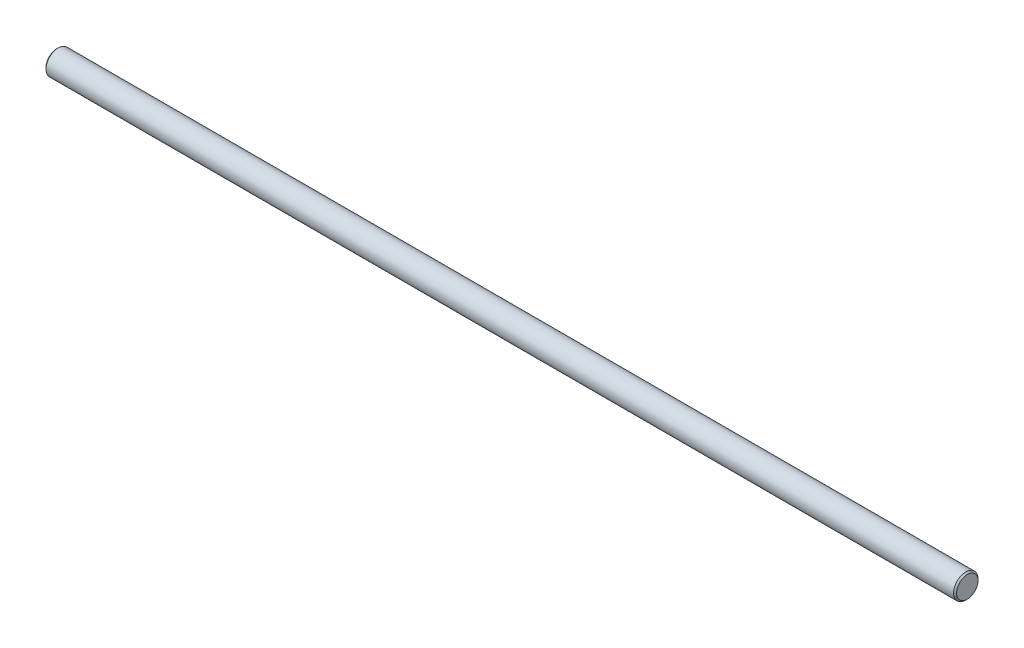
ISO-10303-21;
HEADER;
FILE_DESCRIPTION(('STEP AP214'),'2;1');
FILE_NAME('part.step','',(''),(''),'','','');
FILE_SCHEMA(('AUTOMOTIVE_DESIGN { 1 0 10303 214 1 1 1 1 }'));
ENDSEC;
DATA;
#1=APPLICATION_CONTEXT('core data for automotive mechanical design processes');
#2=APPLICATION_PROTOCOL_DEFINITION('international standard','automotive_design',2000,#1);
#3=PRODUCT_CONTEXT('',#1,'mechanical');
#4=PRODUCT('Part','Part','',(#3));
#5=PRODUCT_RELATED_PRODUCT_CATEGORY('part','',(#4));
#6=PRODUCT_DEFINITION_FORMATION('','',#4);
#7=PRODUCT_DEFINITION_CONTEXT('part definition',#1,'design');
#8=PRODUCT_DEFINITION('design','',#6,#7);
#9=PRODUCT_DEFINITION_SHAPE('','',#8);
#10=(LENGTH_UNIT() NAMED_UNIT(*) SI_UNIT(.MILLI.,.METRE.));
#11=(NAMED_UNIT(*) PLANE_ANGLE_UNIT() SI_UNIT($,.RADIAN.));
#12=(NAMED_UNIT(*) SI_UNIT($,.STERADIAN.) SOLID_ANGLE_UNIT());
#13=UNCERTAINTY_MEASURE_WITH_UNIT(LENGTH_MEASURE(1.E-05),#10,'distance_accuracy_value','');
#14=(GEOMETRIC_REPRESENTATION_CONTEXT(3) GLOBAL_UNCERTAINTY_ASSIGNED_CONTEXT((#13)) GLOBAL_UNIT_ASSIGNED_CONTEXT((#10,
#11,#12)) REPRESENTATION_CONTEXT('',''));
#15=CARTESIAN_POINT('',(0.,0.,0.));
#16=DIRECTION('',(0.,0.,1.));
#17=DIRECTION('',(1.,0.,0.));
#18=AXIS2_PLACEMENT_3D('',#15,#16,#17);
#19=CARTESIAN_POINT('',(88.0014808252774,-23.2372810751357,-160.280625692137));
#20=DIRECTION('',(1.,0.,0.));
#21=DIRECTION('',(0.,1.,0.));
#22=AXIS2_PLACEMENT_3D('',#19,#20,#21);
#23=CYLINDRICAL_SURFACE('',#22,4.00000000000168);
#24=CARTESIAN_POINT('',(99.8151893242669,-23.2372810751357,-160.280625692137));
#25=DIRECTION('',(1.,0.,0.));
#26=DIRECTION('',(0.,1.,0.));
#27=AXIS2_PLACEMENT_3D('',#24,#25,#26);
#28=CIRCLE('',#27,4.00000000000168);
#29=CARTESIAN_POINT('',(99.8151893242669,-19.237281075134,-160.280625692137));
#30=VERTEX_POINT('',#29);
#31=EDGE_CURVE('E38',#30,#30,#28,.T.);
#32=ORIENTED_EDGE('',*,*,#31,.T.);
#33=EDGE_LOOP('',(#32));
#34=FACE_BOUND('',#33,.T.);
#35=CARTESIAN_POINT('',(396.715189324267,-23.2372810751355,-160.280625692138));
#36=DIRECTION('',(1.,0.,0.));
#37=DIRECTION('',(0.,0.,-1.));
#38=AXIS2_PLACEMENT_3D('',#35,#36,#37);
#39=CIRCLE('',#38,4.00000000000168);
#40=CARTESIAN_POINT('',(396.715189324267,-23.2372810751355,-164.280625692139));
#41=VERTEX_POINT('',#40);
#42=EDGE_CURVE('E42',#41,#41,#39,.F.);
#43=ORIENTED_EDGE('',*,*,#42,.T.);
#44=EDGE_LOOP('',(#43));
#45=FACE_BOUND('',#44,.T.);
#46=ADVANCED_FACE('F31',(#34,#45),#23,.T.);
#47=CARTESIAN_POINT('',(397.215189324267,-23.2372810751355,-160.280625692138));
#48=DIRECTION('',(1.,0.,0.));
#49=DIRECTION('',(0.,1.,0.));
#50=AXIS2_PLACEMENT_3D('',#47,#48,#49);
#51=PLANE('',#50);
#52=CARTESIAN_POINT('',(397.215189324267,-23.2372810751355,-160.280625692138));
#53=DIRECTION('',(1.,0.,0.));
#54=DIRECTION('',(0.,1.,0.));
#55=AXIS2_PLACEMENT_3D('',#52,#53,#54);
#56=CIRCLE('',#55,3.50000000000164);
#57=CARTESIAN_POINT('',(397.215189324267,-19.7372810751339,-160.280625692138));
#58=VERTEX_POINT('',#57);
#59=EDGE_CURVE('E10',#58,#58,#56,.T.);
#60=ORIENTED_EDGE('',*,*,#59,.T.);
#61=EDGE_LOOP('',(#60));
#62=FACE_BOUND('',#61,.T.);
#63=ADVANCED_FACE('F62',(#62),#51,.T.);
#64=CARTESIAN_POINT('',(99.3151893242669,-23.2372810751359,-160.280625692138));
#65=DIRECTION('',(1.,0.,0.));
#66=DIRECTION('',(0.,-0.998317998660558,-0.0579756289347322));
#67=AXIS2_PLACEMENT_3D('',#64,#65,#66);
#68=PLANE('',#67);
#69=CARTESIAN_POINT('',(99.3151893242669,-23.2372810751357,-160.280625692137));
#70=DIRECTION('',(1.,0.,0.));
#71=DIRECTION('',(0.,0.,-1.));
#72=AXIS2_PLACEMENT_3D('',#69,#70,#71);
#73=CIRCLE('',#72,3.50000000000167);
#74=CARTESIAN_POINT('',(99.3151893242669,-23.2372810751357,-163.780625692139));
#75=VERTEX_POINT('',#74);
#76=EDGE_CURVE('E46',#75,#75,#73,.F.);
#77=ORIENTED_EDGE('',*,*,#76,.T.);
#78=EDGE_LOOP('',(#77));
#79=FACE_BOUND('',#78,.T.);
#80=ADVANCED_FACE('F52',(#79),#68,.F.);
#81=CARTESIAN_POINT('',(99.3151893242669,-23.2372810751357,-160.280625692137));
#82=DIRECTION('',(1.,0.,0.));
#83=DIRECTION('',(0.,1.,0.));
#84=AXIS2_PLACEMENT_3D('',#81,#82,#83);
#85=CONICAL_SURFACE('',#84,3.50000000000167,0.78539816339744);
#86=ORIENTED_EDGE('',*,*,#31,.F.);
#87=EDGE_LOOP('',(#86));
#88=FACE_BOUND('',#87,.T.);
#89=ORIENTED_EDGE('',*,*,#76,.F.);
#90=EDGE_LOOP('',(#89));
#91=FACE_BOUND('',#90,.T.);
#92=ADVANCED_FACE('F54',(#88,#91),#85,.T.);
#93=CARTESIAN_POINT('',(397.215189324267,-23.2372810751355,-160.280625692138));
#94=DIRECTION('',(-1.,0.,0.));
#95=DIRECTION('',(0.,0.,1.));
#96=AXIS2_PLACEMENT_3D('',#93,#94,#95);
#97=CONICAL_SURFACE('',#96,3.50000000000164,0.785398163397428);
#98=ORIENTED_EDGE('',*,*,#42,.F.);
#99=EDGE_LOOP('',(#98));
#100=FACE_BOUND('',#99,.T.);
#101=ORIENTED_EDGE('',*,*,#59,.F.);
#102=EDGE_LOOP('',(#101));
#103=FACE_BOUND('',#102,.T.);
#104=ADVANCED_FACE('F33',(#100,#103),#97,.T.);
#105=CLOSED_SHELL('',(#46,#63,#80,#92,#104));
#106=MANIFOLD_SOLID_BREP('B2',#105);
#107=ADVANCED_BREP_SHAPE_REPRESENTATION('',(#18,#106),#14);
#108=SHAPE_DEFINITION_REPRESENTATION(#9,#107);
ENDSEC;
END-ISO-10303-21;
